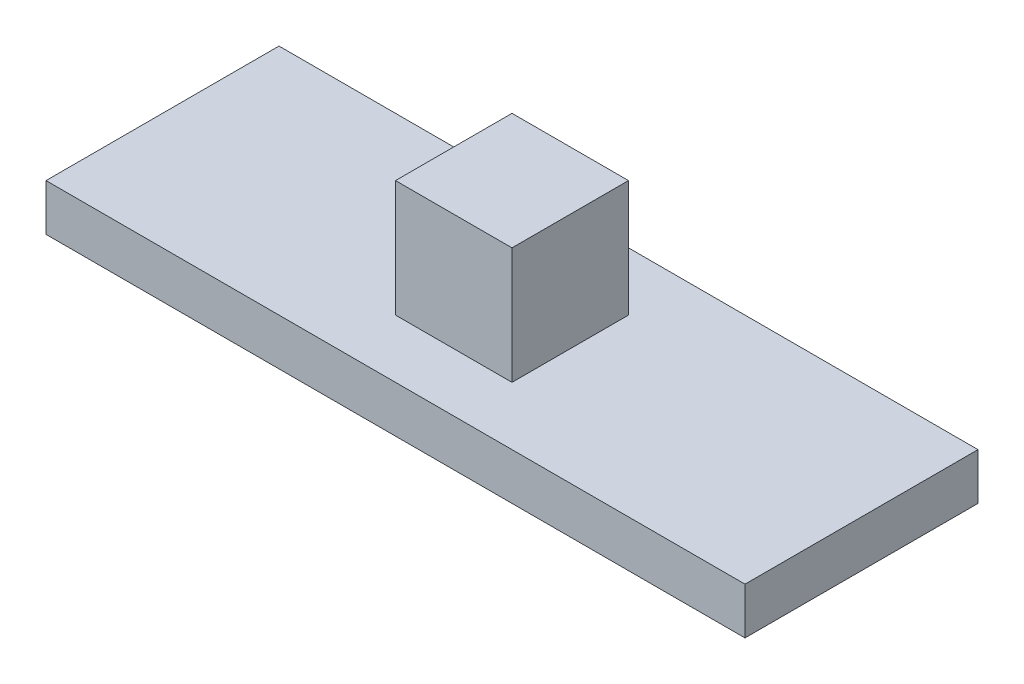
ISO-10303-21;
HEADER;
FILE_DESCRIPTION(('STEP AP214'),'2;1');
FILE_NAME('part.step','',(''),(''),'','','');
FILE_SCHEMA(('AUTOMOTIVE_DESIGN { 1 0 10303 214 1 1 1 1 }'));
ENDSEC;
DATA;
#1=APPLICATION_CONTEXT('core data for automotive mechanical design processes');
#2=APPLICATION_PROTOCOL_DEFINITION('international standard','automotive_design',2000,#1);
#3=PRODUCT_CONTEXT('',#1,'mechanical');
#4=PRODUCT('Part','Part','',(#3));
#5=PRODUCT_RELATED_PRODUCT_CATEGORY('part','',(#4));
#6=PRODUCT_DEFINITION_FORMATION('','',#4);
#7=PRODUCT_DEFINITION_CONTEXT('part definition',#1,'design');
#8=PRODUCT_DEFINITION('design','',#6,#7);
#9=PRODUCT_DEFINITION_SHAPE('','',#8);
#10=(LENGTH_UNIT() NAMED_UNIT(*) SI_UNIT(.MILLI.,.METRE.));
#11=(NAMED_UNIT(*) PLANE_ANGLE_UNIT() SI_UNIT($,.RADIAN.));
#12=(NAMED_UNIT(*) SI_UNIT($,.STERADIAN.) SOLID_ANGLE_UNIT());
#13=UNCERTAINTY_MEASURE_WITH_UNIT(LENGTH_MEASURE(1.E-05),#10,'distance_accuracy_value','');
#14=(GEOMETRIC_REPRESENTATION_CONTEXT(3) GLOBAL_UNCERTAINTY_ASSIGNED_CONTEXT((#13)) GLOBAL_UNIT_ASSIGNED_CONTEXT((#10,
#11,#12)) REPRESENTATION_CONTEXT('',''));
#15=CARTESIAN_POINT('',(0.,0.,0.));
#16=DIRECTION('',(0.,0.,1.));
#17=DIRECTION('',(1.,0.,0.));
#18=AXIS2_PLACEMENT_3D('',#15,#16,#17);
#19=CARTESIAN_POINT('',(0.,2.,0.));
#20=DIRECTION('',(0.,-1.,0.));
#21=DIRECTION('',(0.,0.,-1.));
#22=AXIS2_PLACEMENT_3D('',#19,#20,#21);
#23=PLANE('',#22);
#24=DIRECTION('',(0.,0.,-1.));
#25=VECTOR('',#24,1.);
#26=CARTESIAN_POINT('',(0.,2.,0.));
#27=LINE('',#26,#25);
#28=CARTESIAN_POINT('',(0.,2.,0.));
#29=VERTEX_POINT('',#28);
#30=CARTESIAN_POINT('',(0.,2.,-10.));
#31=VERTEX_POINT('',#30);
#32=EDGE_CURVE('E129',#29,#31,#27,.T.);
#33=ORIENTED_EDGE('',*,*,#32,.F.);
#34=DIRECTION('',(1.,0.,0.));
#35=VECTOR('',#34,1.);
#36=CARTESIAN_POINT('',(0.,2.,0.));
#37=LINE('',#36,#35);
#38=CARTESIAN_POINT('',(30.,2.,0.));
#39=VERTEX_POINT('',#38);
#40=EDGE_CURVE('E138',#29,#39,#37,.T.);
#41=ORIENTED_EDGE('',*,*,#40,.T.);
#42=DIRECTION('',(0.,0.,-1.));
#43=VECTOR('',#42,1.);
#44=CARTESIAN_POINT('',(30.,2.,0.));
#45=LINE('',#44,#43);
#46=CARTESIAN_POINT('',(30.,2.,-10.));
#47=VERTEX_POINT('',#46);
#48=EDGE_CURVE('E136',#39,#47,#45,.T.);
#49=ORIENTED_EDGE('',*,*,#48,.T.);
#50=DIRECTION('',(1.,0.,0.));
#51=VECTOR('',#50,1.);
#52=CARTESIAN_POINT('',(0.,2.,-10.));
#53=LINE('',#52,#51);
#54=EDGE_CURVE('E132',#31,#47,#53,.T.);
#55=ORIENTED_EDGE('',*,*,#54,.F.);
#56=EDGE_LOOP('',(#33,#41,#49,#55));
#57=FACE_BOUND('',#56,.T.);
#58=DIRECTION('',(0.,0.,-1.));
#59=VECTOR('',#58,1.);
#60=CARTESIAN_POINT('',(17.5,2.,-2.5));
#61=LINE('',#60,#59);
#62=CARTESIAN_POINT('',(17.5,2.,-2.5));
#63=VERTEX_POINT('',#62);
#64=CARTESIAN_POINT('',(17.5,2.,-7.5));
#65=VERTEX_POINT('',#64);
#66=EDGE_CURVE('E50',#63,#65,#61,.T.);
#67=ORIENTED_EDGE('',*,*,#66,.F.);
#68=DIRECTION('',(-1.,0.,0.));
#69=VECTOR('',#68,1.);
#70=CARTESIAN_POINT('',(17.5,2.,-2.5));
#71=LINE('',#70,#69);
#72=CARTESIAN_POINT('',(12.5,2.,-2.5));
#73=VERTEX_POINT('',#72);
#74=EDGE_CURVE('E55',#63,#73,#71,.T.);
#75=ORIENTED_EDGE('',*,*,#74,.T.);
#76=DIRECTION('',(0.,0.,-1.));
#77=VECTOR('',#76,1.);
#78=CARTESIAN_POINT('',(12.5,2.,-2.5));
#79=LINE('',#78,#77);
#80=CARTESIAN_POINT('',(12.5,2.,-7.5));
#81=VERTEX_POINT('',#80);
#82=EDGE_CURVE('E260',#73,#81,#79,.T.);
#83=ORIENTED_EDGE('',*,*,#82,.T.);
#84=DIRECTION('',(-1.,0.,0.));
#85=VECTOR('',#84,1.);
#86=CARTESIAN_POINT('',(17.5,2.,-7.5));
#87=LINE('',#86,#85);
#88=EDGE_CURVE('E262',#65,#81,#87,.T.);
#89=ORIENTED_EDGE('',*,*,#88,.F.);
#90=EDGE_LOOP('',(#67,#75,#83,#89));
#91=FACE_BOUND('',#90,.T.);
#92=ADVANCED_FACE('F33',(#57,#91),#23,.F.);
#93=CARTESIAN_POINT('',(0.,2.,0.));
#94=DIRECTION('',(-1.,0.,0.));
#95=DIRECTION('',(0.,0.,1.));
#96=AXIS2_PLACEMENT_3D('',#93,#94,#95);
#97=PLANE('',#96);
#98=DIRECTION('',(0.,0.,-1.));
#99=VECTOR('',#98,1.);
#100=CARTESIAN_POINT('',(0.,0.,0.));
#101=LINE('',#100,#99);
#102=CARTESIAN_POINT('',(0.,0.,0.));
#103=VERTEX_POINT('',#102);
#104=CARTESIAN_POINT('',(0.,0.,-10.));
#105=VERTEX_POINT('',#104);
#106=EDGE_CURVE('E120',#103,#105,#101,.T.);
#107=ORIENTED_EDGE('',*,*,#106,.F.);
#108=DIRECTION('',(0.,-1.,0.));
#109=VECTOR('',#108,1.);
#110=CARTESIAN_POINT('',(0.,2.,0.));
#111=LINE('',#110,#109);
#112=EDGE_CURVE('E11',#29,#103,#111,.T.);
#113=ORIENTED_EDGE('',*,*,#112,.F.);
#114=ORIENTED_EDGE('',*,*,#32,.T.);
#115=DIRECTION('',(0.,-1.,0.));
#116=VECTOR('',#115,1.);
#117=CARTESIAN_POINT('',(0.,2.,-10.));
#118=LINE('',#117,#116);
#119=EDGE_CURVE('E37',#31,#105,#118,.T.);
#120=ORIENTED_EDGE('',*,*,#119,.T.);
#121=EDGE_LOOP('',(#107,#113,#114,#120));
#122=FACE_BOUND('',#121,.T.);
#123=ADVANCED_FACE('F35',(#122),#97,.T.);
#124=CARTESIAN_POINT('',(0.,2.,0.));
#125=DIRECTION('',(0.,0.,-1.));
#126=DIRECTION('',(-1.,0.,0.));
#127=AXIS2_PLACEMENT_3D('',#124,#125,#126);
#128=PLANE('',#127);
#129=DIRECTION('',(1.,0.,0.));
#130=VECTOR('',#129,1.);
#131=CARTESIAN_POINT('',(0.,0.,0.));
#132=LINE('',#131,#130);
#133=CARTESIAN_POINT('',(30.,0.,0.));
#134=VERTEX_POINT('',#133);
#135=EDGE_CURVE('E133',#103,#134,#132,.T.);
#136=ORIENTED_EDGE('',*,*,#135,.T.);
#137=DIRECTION('',(0.,-1.,0.));
#138=VECTOR('',#137,1.);
#139=CARTESIAN_POINT('',(30.,2.,0.));
#140=LINE('',#139,#138);
#141=EDGE_CURVE('E42',#39,#134,#140,.T.);
#142=ORIENTED_EDGE('',*,*,#141,.F.);
#143=ORIENTED_EDGE('',*,*,#40,.F.);
#144=ORIENTED_EDGE('',*,*,#112,.T.);
#145=EDGE_LOOP('',(#136,#142,#143,#144));
#146=FACE_BOUND('',#145,.T.);
#147=ADVANCED_FACE('F162',(#146),#128,.F.);
#148=CARTESIAN_POINT('',(30.,2.,0.));
#149=DIRECTION('',(-1.,0.,0.));
#150=DIRECTION('',(0.,0.,1.));
#151=AXIS2_PLACEMENT_3D('',#148,#149,#150);
#152=PLANE('',#151);
#153=DIRECTION('',(0.,0.,-1.));
#154=VECTOR('',#153,1.);
#155=CARTESIAN_POINT('',(30.,0.,0.));
#156=LINE('',#155,#154);
#157=CARTESIAN_POINT('',(30.,0.,-10.));
#158=VERTEX_POINT('',#157);
#159=EDGE_CURVE('E142',#134,#158,#156,.T.);
#160=ORIENTED_EDGE('',*,*,#159,.T.);
#161=DIRECTION('',(0.,-1.,0.));
#162=VECTOR('',#161,1.);
#163=CARTESIAN_POINT('',(30.,2.,-10.));
#164=LINE('',#163,#162);
#165=EDGE_CURVE('E147',#47,#158,#164,.T.);
#166=ORIENTED_EDGE('',*,*,#165,.F.);
#167=ORIENTED_EDGE('',*,*,#48,.F.);
#168=ORIENTED_EDGE('',*,*,#141,.T.);
#169=EDGE_LOOP('',(#160,#166,#167,#168));
#170=FACE_BOUND('',#169,.T.);
#171=ADVANCED_FACE('F166',(#170),#152,.F.);
#172=CARTESIAN_POINT('',(0.,2.,-10.));
#173=DIRECTION('',(0.,0.,-1.));
#174=DIRECTION('',(-1.,0.,0.));
#175=AXIS2_PLACEMENT_3D('',#172,#173,#174);
#176=PLANE('',#175);
#177=DIRECTION('',(1.,0.,0.));
#178=VECTOR('',#177,1.);
#179=CARTESIAN_POINT('',(0.,0.,-10.));
#180=LINE('',#179,#178);
#181=EDGE_CURVE('E123',#105,#158,#180,.T.);
#182=ORIENTED_EDGE('',*,*,#181,.F.);
#183=ORIENTED_EDGE('',*,*,#119,.F.);
#184=ORIENTED_EDGE('',*,*,#54,.T.);
#185=ORIENTED_EDGE('',*,*,#165,.T.);
#186=EDGE_LOOP('',(#182,#183,#184,#185));
#187=FACE_BOUND('',#186,.T.);
#188=ADVANCED_FACE('F155',(#187),#176,.T.);
#189=CARTESIAN_POINT('',(0.,0.,0.));
#190=DIRECTION('',(0.,-1.,0.));
#191=DIRECTION('',(0.,0.,-1.));
#192=AXIS2_PLACEMENT_3D('',#189,#190,#191);
#193=PLANE('',#192);
#194=ORIENTED_EDGE('',*,*,#106,.T.);
#195=ORIENTED_EDGE('',*,*,#181,.T.);
#196=ORIENTED_EDGE('',*,*,#159,.F.);
#197=ORIENTED_EDGE('',*,*,#135,.F.);
#198=EDGE_LOOP('',(#194,#195,#196,#197));
#199=FACE_BOUND('',#198,.T.);
#200=ADVANCED_FACE('F159',(#199),#193,.T.);
#201=CARTESIAN_POINT('',(17.5,7.,-2.5));
#202=DIRECTION('',(-1.,0.,0.));
#203=DIRECTION('',(0.,0.,1.));
#204=AXIS2_PLACEMENT_3D('',#201,#202,#203);
#205=PLANE('',#204);
#206=ORIENTED_EDGE('',*,*,#66,.T.);
#207=DIRECTION('',(0.,-1.,0.));
#208=VECTOR('',#207,1.);
#209=CARTESIAN_POINT('',(17.5,7.,-7.5));
#210=LINE('',#209,#208);
#211=CARTESIAN_POINT('',(17.5,7.,-7.5));
#212=VERTEX_POINT('',#211);
#213=EDGE_CURVE('E103',#212,#65,#210,.T.);
#214=ORIENTED_EDGE('',*,*,#213,.F.);
#215=DIRECTION('',(0.,0.,-1.));
#216=VECTOR('',#215,1.);
#217=CARTESIAN_POINT('',(17.5,7.,-2.5));
#218=LINE('',#217,#216);
#219=CARTESIAN_POINT('',(17.5,7.,-2.5));
#220=VERTEX_POINT('',#219);
#221=EDGE_CURVE('E110',#220,#212,#218,.T.);
#222=ORIENTED_EDGE('',*,*,#221,.F.);
#223=DIRECTION('',(0.,-1.,0.));
#224=VECTOR('',#223,1.);
#225=CARTESIAN_POINT('',(17.5,7.,-2.5));
#226=LINE('',#225,#224);
#227=EDGE_CURVE('E258',#220,#63,#226,.T.);
#228=ORIENTED_EDGE('',*,*,#227,.T.);
#229=EDGE_LOOP('',(#206,#214,#222,#228));
#230=FACE_BOUND('',#229,.T.);
#231=ADVANCED_FACE('F119',(#230),#205,.F.);
#232=CARTESIAN_POINT('',(17.5,7.,-7.5));
#233=DIRECTION('',(0.,0.,1.));
#234=DIRECTION('',(1.,0.,0.));
#235=AXIS2_PLACEMENT_3D('',#232,#233,#234);
#236=PLANE('',#235);
#237=ORIENTED_EDGE('',*,*,#88,.T.);
#238=DIRECTION('',(0.,-1.,0.));
#239=VECTOR('',#238,1.);
#240=CARTESIAN_POINT('',(12.5,7.,-7.5));
#241=LINE('',#240,#239);
#242=CARTESIAN_POINT('',(12.5,7.,-7.5));
#243=VERTEX_POINT('',#242);
#244=EDGE_CURVE('E105',#243,#81,#241,.T.);
#245=ORIENTED_EDGE('',*,*,#244,.F.);
#246=DIRECTION('',(-1.,0.,0.));
#247=VECTOR('',#246,1.);
#248=CARTESIAN_POINT('',(17.5,7.,-7.5));
#249=LINE('',#248,#247);
#250=EDGE_CURVE('E98',#212,#243,#249,.T.);
#251=ORIENTED_EDGE('',*,*,#250,.F.);
#252=ORIENTED_EDGE('',*,*,#213,.T.);
#253=EDGE_LOOP('',(#237,#245,#251,#252));
#254=FACE_BOUND('',#253,.T.);
#255=ADVANCED_FACE('F101',(#254),#236,.F.);
#256=CARTESIAN_POINT('',(12.5,7.,-2.5));
#257=DIRECTION('',(-1.,0.,0.));
#258=DIRECTION('',(0.,0.,1.));
#259=AXIS2_PLACEMENT_3D('',#256,#257,#258);
#260=PLANE('',#259);
#261=ORIENTED_EDGE('',*,*,#82,.F.);
#262=DIRECTION('',(0.,-1.,0.));
#263=VECTOR('',#262,1.);
#264=CARTESIAN_POINT('',(12.5,7.,-2.5));
#265=LINE('',#264,#263);
#266=CARTESIAN_POINT('',(12.5,7.,-2.5));
#267=VERTEX_POINT('',#266);
#268=EDGE_CURVE('E125',#267,#73,#265,.T.);
#269=ORIENTED_EDGE('',*,*,#268,.F.);
#270=DIRECTION('',(0.,0.,-1.));
#271=VECTOR('',#270,1.);
#272=CARTESIAN_POINT('',(12.5,7.,-2.5));
#273=LINE('',#272,#271);
#274=EDGE_CURVE('E109',#267,#243,#273,.T.);
#275=ORIENTED_EDGE('',*,*,#274,.T.);
#276=ORIENTED_EDGE('',*,*,#244,.T.);
#277=EDGE_LOOP('',(#261,#269,#275,#276));
#278=FACE_BOUND('',#277,.T.);
#279=ADVANCED_FACE('F201',(#278),#260,.T.);
#280=CARTESIAN_POINT('',(17.5,7.,-2.5));
#281=DIRECTION('',(0.,0.,1.));
#282=DIRECTION('',(1.,0.,0.));
#283=AXIS2_PLACEMENT_3D('',#280,#281,#282);
#284=PLANE('',#283);
#285=ORIENTED_EDGE('',*,*,#74,.F.);
#286=ORIENTED_EDGE('',*,*,#227,.F.);
#287=DIRECTION('',(-1.,0.,0.));
#288=VECTOR('',#287,1.);
#289=CARTESIAN_POINT('',(17.5,7.,-2.5));
#290=LINE('',#289,#288);
#291=EDGE_CURVE('E116',#220,#267,#290,.T.);
#292=ORIENTED_EDGE('',*,*,#291,.T.);
#293=ORIENTED_EDGE('',*,*,#268,.T.);
#294=EDGE_LOOP('',(#285,#286,#292,#293));
#295=FACE_BOUND('',#294,.T.);
#296=ADVANCED_FACE('F207',(#295),#284,.T.);
#297=CARTESIAN_POINT('',(0.,7.,0.));
#298=DIRECTION('',(0.,1.,0.));
#299=DIRECTION('',(0.,0.,1.));
#300=AXIS2_PLACEMENT_3D('',#297,#298,#299);
#301=PLANE('',#300);
#302=ORIENTED_EDGE('',*,*,#221,.T.);
#303=ORIENTED_EDGE('',*,*,#250,.T.);
#304=ORIENTED_EDGE('',*,*,#274,.F.);
#305=ORIENTED_EDGE('',*,*,#291,.F.);
#306=EDGE_LOOP('',(#302,#303,#304,#305));
#307=FACE_BOUND('',#306,.T.);
#308=ADVANCED_FACE('F114',(#307),#301,.T.);
#309=CLOSED_SHELL('',(#92,#123,#147,#171,#188,#200,#231,#255,#279,#296,#308));
#310=MANIFOLD_SOLID_BREP('B2',#309);
#311=ADVANCED_BREP_SHAPE_REPRESENTATION('',(#18,#310),#14);
#312=SHAPE_DEFINITION_REPRESENTATION(#9,#311);
ENDSEC;
END-ISO-10303-21;
